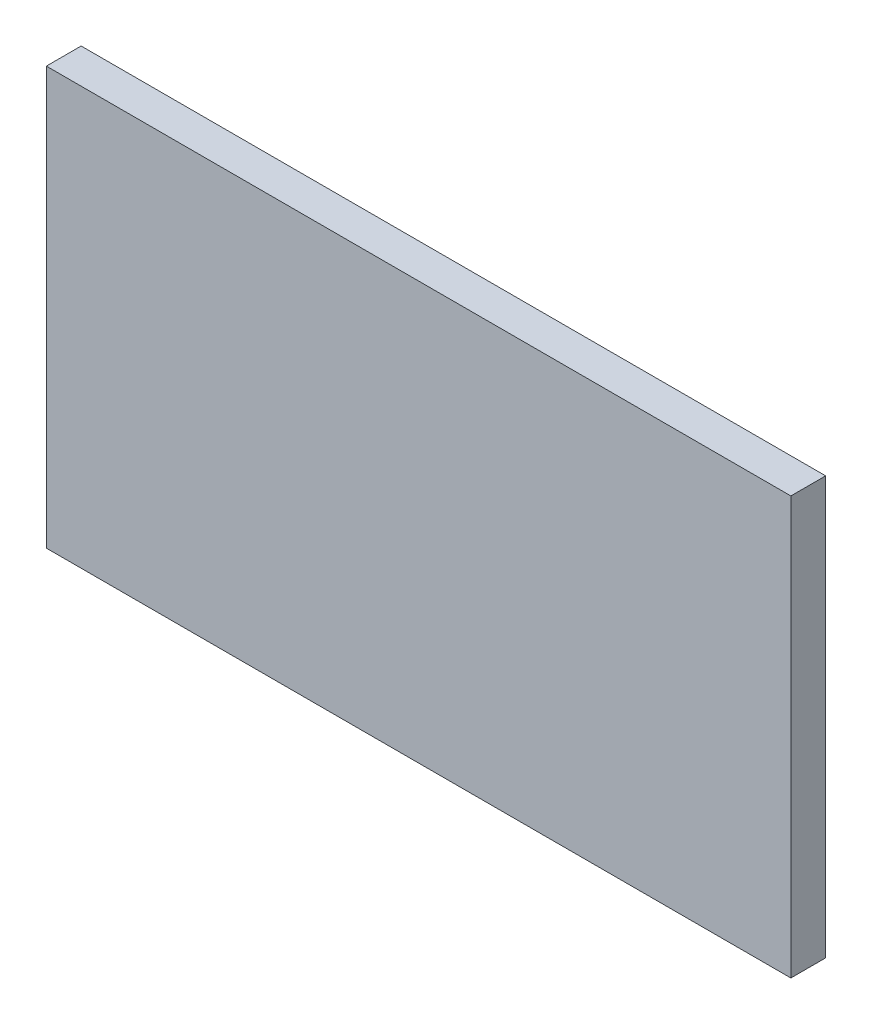
ISO-10303-21;
HEADER;
FILE_DESCRIPTION(('STEP AP214'),'2;1');
FILE_NAME('part.step','',(''),(''),'','','');
FILE_SCHEMA(('AUTOMOTIVE_DESIGN { 1 0 10303 214 1 1 1 1 }'));
ENDSEC;
DATA;
#1=APPLICATION_CONTEXT('core data for automotive mechanical design processes');
#2=APPLICATION_PROTOCOL_DEFINITION('international standard','automotive_design',2000,#1);
#3=PRODUCT_CONTEXT('',#1,'mechanical');
#4=PRODUCT('Part','Part','',(#3));
#5=PRODUCT_RELATED_PRODUCT_CATEGORY('part','',(#4));
#6=PRODUCT_DEFINITION_FORMATION('','',#4);
#7=PRODUCT_DEFINITION_CONTEXT('part definition',#1,'design');
#8=PRODUCT_DEFINITION('design','',#6,#7);
#9=PRODUCT_DEFINITION_SHAPE('','',#8);
#10=(LENGTH_UNIT() NAMED_UNIT(*) SI_UNIT(.MILLI.,.METRE.));
#11=(NAMED_UNIT(*) PLANE_ANGLE_UNIT() SI_UNIT($,.RADIAN.));
#12=(NAMED_UNIT(*) SI_UNIT($,.STERADIAN.) SOLID_ANGLE_UNIT());
#13=UNCERTAINTY_MEASURE_WITH_UNIT(LENGTH_MEASURE(1.E-05),#10,'distance_accuracy_value','');
#14=(GEOMETRIC_REPRESENTATION_CONTEXT(3) GLOBAL_UNCERTAINTY_ASSIGNED_CONTEXT((#13)) GLOBAL_UNIT_ASSIGNED_CONTEXT((#10,
#11,#12)) REPRESENTATION_CONTEXT('',''));
#15=CARTESIAN_POINT('',(0.,0.,0.));
#16=DIRECTION('',(0.,0.,1.));
#17=DIRECTION('',(1.,0.,0.));
#18=AXIS2_PLACEMENT_3D('',#15,#16,#17);
#19=CARTESIAN_POINT('',(-107.,-60.,10.));
#20=DIRECTION('',(1.,0.,0.));
#21=DIRECTION('',(0.,0.,-1.));
#22=AXIS2_PLACEMENT_3D('',#19,#20,#21);
#23=PLANE('',#22);
#24=DIRECTION('',(0.,-1.,0.));
#25=VECTOR('',#24,1.);
#26=CARTESIAN_POINT('',(-107.,-60.,0.));
#27=LINE('',#26,#25);
#28=CARTESIAN_POINT('',(-107.,60.,0.));
#29=VERTEX_POINT('',#28);
#30=CARTESIAN_POINT('',(-107.,-60.,0.));
#31=VERTEX_POINT('',#30);
#32=EDGE_CURVE('E98',#29,#31,#27,.T.);
#33=ORIENTED_EDGE('',*,*,#32,.T.);
#34=DIRECTION('',(0.,0.,-1.));
#35=VECTOR('',#34,1.);
#36=CARTESIAN_POINT('',(-107.,-60.,10.));
#37=LINE('',#36,#35);
#38=CARTESIAN_POINT('',(-107.,-60.,10.));
#39=VERTEX_POINT('',#38);
#40=EDGE_CURVE('E11',#39,#31,#37,.T.);
#41=ORIENTED_EDGE('',*,*,#40,.F.);
#42=DIRECTION('',(0.,-1.,0.));
#43=VECTOR('',#42,1.);
#44=CARTESIAN_POINT('',(-107.,-60.,10.));
#45=LINE('',#44,#43);
#46=CARTESIAN_POINT('',(-107.,60.,10.));
#47=VERTEX_POINT('',#46);
#48=EDGE_CURVE('E86',#47,#39,#45,.T.);
#49=ORIENTED_EDGE('',*,*,#48,.F.);
#50=DIRECTION('',(0.,0.,-1.));
#51=VECTOR('',#50,1.);
#52=CARTESIAN_POINT('',(-107.,60.,10.));
#53=LINE('',#52,#51);
#54=EDGE_CURVE('E94',#47,#29,#53,.T.);
#55=ORIENTED_EDGE('',*,*,#54,.T.);
#56=EDGE_LOOP('',(#33,#41,#49,#55));
#57=FACE_BOUND('',#56,.T.);
#58=ADVANCED_FACE('F35',(#57),#23,.F.);
#59=CARTESIAN_POINT('',(107.,-60.,10.));
#60=DIRECTION('',(0.,1.,0.));
#61=DIRECTION('',(-1.,0.,0.));
#62=AXIS2_PLACEMENT_3D('',#59,#60,#61);
#63=PLANE('',#62);
#64=DIRECTION('',(1.,0.,0.));
#65=VECTOR('',#64,1.);
#66=CARTESIAN_POINT('',(107.,-60.,0.));
#67=LINE('',#66,#65);
#68=CARTESIAN_POINT('',(107.,-60.,0.));
#69=VERTEX_POINT('',#68);
#70=EDGE_CURVE('E90',#31,#69,#67,.T.);
#71=ORIENTED_EDGE('',*,*,#70,.T.);
#72=DIRECTION('',(0.,0.,-1.));
#73=VECTOR('',#72,1.);
#74=CARTESIAN_POINT('',(107.,-60.,10.));
#75=LINE('',#74,#73);
#76=CARTESIAN_POINT('',(107.,-60.,10.));
#77=VERTEX_POINT('',#76);
#78=EDGE_CURVE('E43',#77,#69,#75,.T.);
#79=ORIENTED_EDGE('',*,*,#78,.F.);
#80=DIRECTION('',(1.,0.,0.));
#81=VECTOR('',#80,1.);
#82=CARTESIAN_POINT('',(107.,-60.,10.));
#83=LINE('',#82,#81);
#84=EDGE_CURVE('E81',#39,#77,#83,.T.);
#85=ORIENTED_EDGE('',*,*,#84,.F.);
#86=ORIENTED_EDGE('',*,*,#40,.T.);
#87=EDGE_LOOP('',(#71,#79,#85,#86));
#88=FACE_BOUND('',#87,.T.);
#89=ADVANCED_FACE('F89',(#88),#63,.F.);
#90=CARTESIAN_POINT('',(107.,-60.,10.));
#91=DIRECTION('',(-1.,0.,0.));
#92=DIRECTION('',(0.,0.,1.));
#93=AXIS2_PLACEMENT_3D('',#90,#91,#92);
#94=PLANE('',#93);
#95=DIRECTION('',(0.,1.,0.));
#96=VECTOR('',#95,1.);
#97=CARTESIAN_POINT('',(107.,-60.,0.));
#98=LINE('',#97,#96);
#99=CARTESIAN_POINT('',(107.,60.,0.));
#100=VERTEX_POINT('',#99);
#101=EDGE_CURVE('E68',#69,#100,#98,.T.);
#102=ORIENTED_EDGE('',*,*,#101,.T.);
#103=DIRECTION('',(0.,0.,-1.));
#104=VECTOR('',#103,1.);
#105=CARTESIAN_POINT('',(107.,60.,10.));
#106=LINE('',#105,#104);
#107=CARTESIAN_POINT('',(107.,60.,10.));
#108=VERTEX_POINT('',#107);
#109=EDGE_CURVE('E91',#108,#100,#106,.T.);
#110=ORIENTED_EDGE('',*,*,#109,.F.);
#111=DIRECTION('',(0.,1.,0.));
#112=VECTOR('',#111,1.);
#113=CARTESIAN_POINT('',(107.,-60.,10.));
#114=LINE('',#113,#112);
#115=EDGE_CURVE('E84',#77,#108,#114,.T.);
#116=ORIENTED_EDGE('',*,*,#115,.F.);
#117=ORIENTED_EDGE('',*,*,#78,.T.);
#118=EDGE_LOOP('',(#102,#110,#116,#117));
#119=FACE_BOUND('',#118,.T.);
#120=ADVANCED_FACE('F92',(#119),#94,.F.);
#121=CARTESIAN_POINT('',(107.,60.,10.));
#122=DIRECTION('',(0.,-1.,0.));
#123=DIRECTION('',(1.,0.,0.));
#124=AXIS2_PLACEMENT_3D('',#121,#122,#123);
#125=PLANE('',#124);
#126=DIRECTION('',(-1.,0.,0.));
#127=VECTOR('',#126,1.);
#128=CARTESIAN_POINT('',(107.,60.,0.));
#129=LINE('',#128,#127);
#130=EDGE_CURVE('E74',#100,#29,#129,.T.);
#131=ORIENTED_EDGE('',*,*,#130,.T.);
#132=ORIENTED_EDGE('',*,*,#54,.F.);
#133=DIRECTION('',(-1.,0.,0.));
#134=VECTOR('',#133,1.);
#135=CARTESIAN_POINT('',(107.,60.,10.));
#136=LINE('',#135,#134);
#137=EDGE_CURVE('E51',#108,#47,#136,.T.);
#138=ORIENTED_EDGE('',*,*,#137,.F.);
#139=ORIENTED_EDGE('',*,*,#109,.T.);
#140=EDGE_LOOP('',(#131,#132,#138,#139));
#141=FACE_BOUND('',#140,.T.);
#142=ADVANCED_FACE('F105',(#141),#125,.F.);
#143=CARTESIAN_POINT('',(0.,0.,10.));
#144=DIRECTION('',(0.,0.,1.));
#145=DIRECTION('',(1.,0.,0.));
#146=AXIS2_PLACEMENT_3D('',#143,#144,#145);
#147=PLANE('',#146);
#148=ORIENTED_EDGE('',*,*,#48,.T.);
#149=ORIENTED_EDGE('',*,*,#84,.T.);
#150=ORIENTED_EDGE('',*,*,#115,.T.);
#151=ORIENTED_EDGE('',*,*,#137,.T.);
#152=EDGE_LOOP('',(#148,#149,#150,#151));
#153=FACE_BOUND('',#152,.T.);
#154=ADVANCED_FACE('F82',(#153),#147,.T.);
#155=CARTESIAN_POINT('',(0.,0.,0.));
#156=DIRECTION('',(0.,0.,1.));
#157=DIRECTION('',(1.,0.,0.));
#158=AXIS2_PLACEMENT_3D('',#155,#156,#157);
#159=PLANE('',#158);
#160=ORIENTED_EDGE('',*,*,#32,.F.);
#161=ORIENTED_EDGE('',*,*,#130,.F.);
#162=ORIENTED_EDGE('',*,*,#101,.F.);
#163=ORIENTED_EDGE('',*,*,#70,.F.);
#164=EDGE_LOOP('',(#160,#161,#162,#163));
#165=FACE_BOUND('',#164,.T.);
#166=ADVANCED_FACE('F108',(#165),#159,.F.);
#167=CLOSED_SHELL('',(#58,#89,#120,#142,#154,#166));
#168=MANIFOLD_SOLID_BREP('B2',#167);
#169=ADVANCED_BREP_SHAPE_REPRESENTATION('',(#18,#168),#14);
#170=SHAPE_DEFINITION_REPRESENTATION(#9,#169);
ENDSEC;
END-ISO-10303-21;
